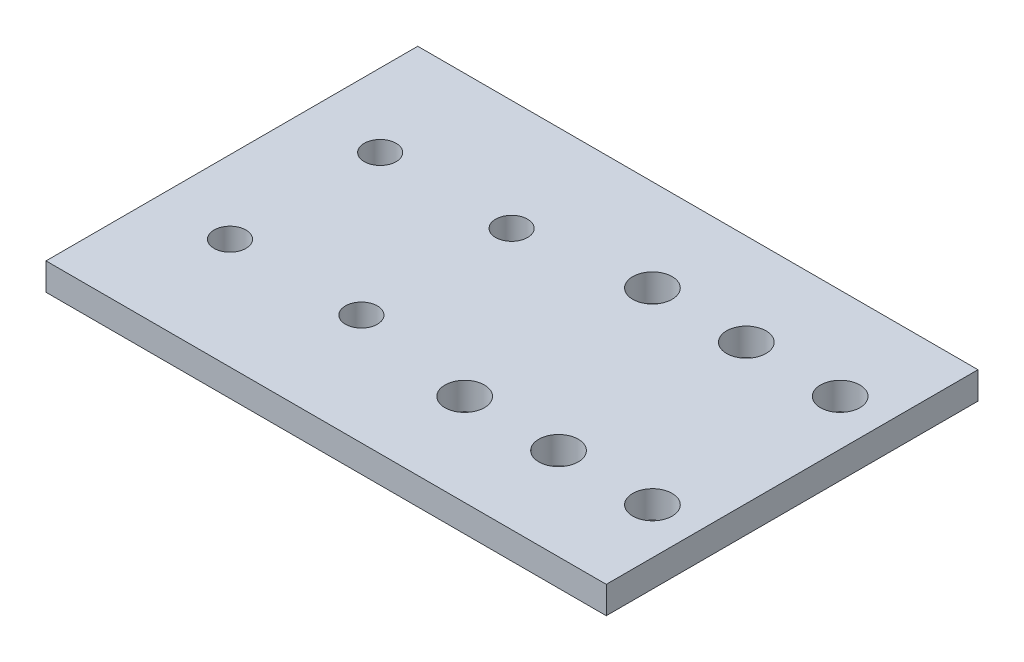
ISO-10303-21;
HEADER;
FILE_DESCRIPTION(('STEP AP214'),'2;1');
FILE_NAME('part.step','',(''),(''),'','','');
FILE_SCHEMA(('AUTOMOTIVE_DESIGN { 1 0 10303 214 1 1 1 1 }'));
ENDSEC;
DATA;
#1=APPLICATION_CONTEXT('core data for automotive mechanical design processes');
#2=APPLICATION_PROTOCOL_DEFINITION('international standard','automotive_design',2000,#1);
#3=PRODUCT_CONTEXT('',#1,'mechanical');
#4=PRODUCT('Part','Part','',(#3));
#5=PRODUCT_RELATED_PRODUCT_CATEGORY('part','',(#4));
#6=PRODUCT_DEFINITION_FORMATION('','',#4);
#7=PRODUCT_DEFINITION_CONTEXT('part definition',#1,'design');
#8=PRODUCT_DEFINITION('design','',#6,#7);
#9=PRODUCT_DEFINITION_SHAPE('','',#8);
#10=(LENGTH_UNIT() NAMED_UNIT(*) SI_UNIT(.MILLI.,.METRE.));
#11=(NAMED_UNIT(*) PLANE_ANGLE_UNIT() SI_UNIT($,.RADIAN.));
#12=(NAMED_UNIT(*) SI_UNIT($,.STERADIAN.) SOLID_ANGLE_UNIT());
#13=UNCERTAINTY_MEASURE_WITH_UNIT(LENGTH_MEASURE(1.E-05),#10,'distance_accuracy_value','');
#14=(GEOMETRIC_REPRESENTATION_CONTEXT(3) GLOBAL_UNCERTAINTY_ASSIGNED_CONTEXT((#13)) GLOBAL_UNIT_ASSIGNED_CONTEXT((#10,
#11,#12)) REPRESENTATION_CONTEXT('',''));
#15=CARTESIAN_POINT('',(0.,0.,0.));
#16=DIRECTION('',(0.,0.,1.));
#17=DIRECTION('',(1.,0.,0.));
#18=AXIS2_PLACEMENT_3D('',#15,#16,#17);
#19=CARTESIAN_POINT('',(0.,2.9,0.));
#20=DIRECTION('',(0.,1.,0.));
#21=DIRECTION('',(0.,0.,1.));
#22=AXIS2_PLACEMENT_3D('',#19,#20,#21);
#23=PLANE('',#22);
#24=DIRECTION('',(0.,0.,1.));
#25=VECTOR('',#24,1.);
#26=CARTESIAN_POINT('',(-10.1174307944163,2.9,0.));
#27=LINE('',#26,#25);
#28=CARTESIAN_POINT('',(-10.1174307944163,2.9,-119.8));
#29=VERTEX_POINT('',#28);
#30=CARTESIAN_POINT('',(-10.1174307944163,2.9,-80.2));
#31=VERTEX_POINT('',#30);
#32=EDGE_CURVE('E61',#29,#31,#27,.T.);
#33=ORIENTED_EDGE('',*,*,#32,.F.);
#34=DIRECTION('',(-1.,0.,0.));
#35=VECTOR('',#34,1.);
#36=CARTESIAN_POINT('',(-69.8,2.9,-119.8));
#37=LINE('',#36,#35);
#38=CARTESIAN_POINT('',(-69.8,2.9,-119.8));
#39=VERTEX_POINT('',#38);
#40=EDGE_CURVE('E97',#29,#39,#37,.T.);
#41=ORIENTED_EDGE('',*,*,#40,.T.);
#42=DIRECTION('',(0.,0.,1.));
#43=VECTOR('',#42,1.);
#44=CARTESIAN_POINT('',(-69.8,2.9,-119.8));
#45=LINE('',#44,#43);
#46=CARTESIAN_POINT('',(-69.8,2.9,-80.2));
#47=VERTEX_POINT('',#46);
#48=EDGE_CURVE('E106',#39,#47,#45,.T.);
#49=ORIENTED_EDGE('',*,*,#48,.T.);
#50=DIRECTION('',(1.,0.,0.));
#51=VECTOR('',#50,1.);
#52=CARTESIAN_POINT('',(-69.8,2.9,-80.2));
#53=LINE('',#52,#51);
#54=EDGE_CURVE('E68',#47,#31,#53,.T.);
#55=ORIENTED_EDGE('',*,*,#54,.T.);
#56=EDGE_LOOP('',(#33,#41,#49,#55));
#57=FACE_BOUND('',#56,.T.);
#58=CARTESIAN_POINT('',(-15.0000000000003,2.9,-110.));
#59=DIRECTION('',(0.,1.,0.));
#60=DIRECTION('',(0.,0.,1.));
#61=AXIS2_PLACEMENT_3D('',#58,#59,#60);
#62=CIRCLE('',#61,2.1);
#63=CARTESIAN_POINT('',(-15.0000000000003,2.9,-107.9));
#64=VERTEX_POINT('',#63);
#65=EDGE_CURVE('E130',#64,#64,#62,.T.);
#66=ORIENTED_EDGE('',*,*,#65,.F.);
#67=EDGE_LOOP('',(#66));
#68=FACE_BOUND('',#67,.T.);
#69=CARTESIAN_POINT('',(-15.0000000000003,2.9,-90.));
#70=DIRECTION('',(0.,1.,0.));
#71=DIRECTION('',(0.,0.,1.));
#72=AXIS2_PLACEMENT_3D('',#69,#70,#71);
#73=CIRCLE('',#72,2.1);
#74=CARTESIAN_POINT('',(-15.0000000000003,2.9,-87.9));
#75=VERTEX_POINT('',#74);
#76=EDGE_CURVE('E122',#75,#75,#73,.F.);
#77=ORIENTED_EDGE('',*,*,#76,.T.);
#78=EDGE_LOOP('',(#77));
#79=FACE_BOUND('',#78,.T.);
#80=CARTESIAN_POINT('',(-25.,2.9,-90.));
#81=DIRECTION('',(0.,1.,0.));
#82=DIRECTION('',(0.,0.,1.));
#83=AXIS2_PLACEMENT_3D('',#80,#81,#82);
#84=CIRCLE('',#83,2.1);
#85=CARTESIAN_POINT('',(-25.,2.9,-87.9));
#86=VERTEX_POINT('',#85);
#87=EDGE_CURVE('E154',#86,#86,#84,.F.);
#88=ORIENTED_EDGE('',*,*,#87,.T.);
#89=EDGE_LOOP('',(#88));
#90=FACE_BOUND('',#89,.T.);
#91=CARTESIAN_POINT('',(-62.,2.9,-108.));
#92=DIRECTION('',(0.,1.,0.));
#93=DIRECTION('',(0.,0.,1.));
#94=AXIS2_PLACEMENT_3D('',#91,#92,#93);
#95=CIRCLE('',#94,1.7);
#96=CARTESIAN_POINT('',(-62.,2.9,-106.3));
#97=VERTEX_POINT('',#96);
#98=EDGE_CURVE('E55',#97,#97,#95,.F.);
#99=ORIENTED_EDGE('',*,*,#98,.T.);
#100=EDGE_LOOP('',(#99));
#101=FACE_BOUND('',#100,.T.);
#102=CARTESIAN_POINT('',(-48.,2.9,-92.));
#103=DIRECTION('',(0.,1.,0.));
#104=DIRECTION('',(0.,0.,1.));
#105=AXIS2_PLACEMENT_3D('',#102,#103,#104);
#106=CIRCLE('',#105,1.7);
#107=CARTESIAN_POINT('',(-48.,2.9,-90.3));
#108=VERTEX_POINT('',#107);
#109=EDGE_CURVE('E182',#108,#108,#106,.T.);
#110=ORIENTED_EDGE('',*,*,#109,.F.);
#111=EDGE_LOOP('',(#110));
#112=FACE_BOUND('',#111,.T.);
#113=CARTESIAN_POINT('',(-48.,2.9,-108.));
#114=DIRECTION('',(0.,1.,0.));
#115=DIRECTION('',(0.,0.,1.));
#116=AXIS2_PLACEMENT_3D('',#113,#114,#115);
#117=CIRCLE('',#116,1.7);
#118=CARTESIAN_POINT('',(-48.,2.9,-106.3));
#119=VERTEX_POINT('',#118);
#120=EDGE_CURVE('E177',#119,#119,#117,.F.);
#121=ORIENTED_EDGE('',*,*,#120,.T.);
#122=EDGE_LOOP('',(#121));
#123=FACE_BOUND('',#122,.T.);
#124=CARTESIAN_POINT('',(-62.,2.9,-92.));
#125=DIRECTION('',(0.,1.,0.));
#126=DIRECTION('',(0.,0.,1.));
#127=AXIS2_PLACEMENT_3D('',#124,#125,#126);
#128=CIRCLE('',#127,1.7);
#129=CARTESIAN_POINT('',(-62.,2.9,-90.3));
#130=VERTEX_POINT('',#129);
#131=EDGE_CURVE('E173',#130,#130,#128,.T.);
#132=ORIENTED_EDGE('',*,*,#131,.F.);
#133=EDGE_LOOP('',(#132));
#134=FACE_BOUND('',#133,.T.);
#135=CARTESIAN_POINT('',(-35.,2.9,-110.));
#136=DIRECTION('',(0.,1.,0.));
#137=DIRECTION('',(0.,0.,1.));
#138=AXIS2_PLACEMENT_3D('',#135,#136,#137);
#139=CIRCLE('',#138,2.1);
#140=CARTESIAN_POINT('',(-35.,2.9,-107.9));
#141=VERTEX_POINT('',#140);
#142=EDGE_CURVE('E145',#141,#141,#139,.T.);
#143=ORIENTED_EDGE('',*,*,#142,.F.);
#144=EDGE_LOOP('',(#143));
#145=FACE_BOUND('',#144,.T.);
#146=CARTESIAN_POINT('',(-35.,2.9,-89.9999999999999));
#147=DIRECTION('',(0.,1.,0.));
#148=DIRECTION('',(0.,0.,1.));
#149=AXIS2_PLACEMENT_3D('',#146,#147,#148);
#150=CIRCLE('',#149,2.1);
#151=CARTESIAN_POINT('',(-35.,2.9,-87.8999999999999));
#152=VERTEX_POINT('',#151);
#153=EDGE_CURVE('E146',#152,#152,#150,.F.);
#154=ORIENTED_EDGE('',*,*,#153,.T.);
#155=EDGE_LOOP('',(#154));
#156=FACE_BOUND('',#155,.T.);
#157=CARTESIAN_POINT('',(-25.0000000000003,2.9,-110.));
#158=DIRECTION('',(0.,1.,0.));
#159=DIRECTION('',(0.,0.,1.));
#160=AXIS2_PLACEMENT_3D('',#157,#158,#159);
#161=CIRCLE('',#160,2.10000000000022);
#162=CARTESIAN_POINT('',(-25.0000000000003,2.9,-107.9));
#163=VERTEX_POINT('',#162);
#164=EDGE_CURVE('E134',#163,#163,#161,.T.);
#165=ORIENTED_EDGE('',*,*,#164,.F.);
#166=EDGE_LOOP('',(#165));
#167=FACE_BOUND('',#166,.T.);
#168=ADVANCED_FACE('F46',(#57,#68,#79,#90,#101,#112,#123,#134,#145,#156,#167),#23,.T.);
#169=CARTESIAN_POINT('',(0.,0.,0.));
#170=DIRECTION('',(0.,1.,0.));
#171=DIRECTION('',(0.,0.,1.));
#172=AXIS2_PLACEMENT_3D('',#169,#170,#171);
#173=PLANE('',#172);
#174=CARTESIAN_POINT('',(-15.0000000000003,0.,-110.));
#175=DIRECTION('',(0.,1.,0.));
#176=DIRECTION('',(0.,0.,1.));
#177=AXIS2_PLACEMENT_3D('',#174,#175,#176);
#178=CIRCLE('',#177,2.1);
#179=CARTESIAN_POINT('',(-15.0000000000003,0.,-107.9));
#180=VERTEX_POINT('',#179);
#181=EDGE_CURVE('E129',#180,#180,#178,.T.);
#182=ORIENTED_EDGE('',*,*,#181,.T.);
#183=EDGE_LOOP('',(#182));
#184=FACE_BOUND('',#183,.T.);
#185=CARTESIAN_POINT('',(-15.0000000000003,0.,-90.));
#186=DIRECTION('',(0.,1.,0.));
#187=DIRECTION('',(0.,0.,1.));
#188=AXIS2_PLACEMENT_3D('',#185,#186,#187);
#189=CIRCLE('',#188,2.1);
#190=CARTESIAN_POINT('',(-15.0000000000003,0.,-87.9));
#191=VERTEX_POINT('',#190);
#192=EDGE_CURVE('E125',#191,#191,#189,.F.);
#193=ORIENTED_EDGE('',*,*,#192,.F.);
#194=EDGE_LOOP('',(#193));
#195=FACE_BOUND('',#194,.T.);
#196=CARTESIAN_POINT('',(-25.,0.,-90.));
#197=DIRECTION('',(0.,1.,0.));
#198=DIRECTION('',(0.,0.,1.));
#199=AXIS2_PLACEMENT_3D('',#196,#197,#198);
#200=CIRCLE('',#199,2.1);
#201=CARTESIAN_POINT('',(-25.,0.,-87.9));
#202=VERTEX_POINT('',#201);
#203=EDGE_CURVE('E150',#202,#202,#200,.F.);
#204=ORIENTED_EDGE('',*,*,#203,.F.);
#205=EDGE_LOOP('',(#204));
#206=FACE_BOUND('',#205,.T.);
#207=CARTESIAN_POINT('',(-35.,0.,-89.9999999999999));
#208=DIRECTION('',(0.,1.,0.));
#209=DIRECTION('',(0.,0.,1.));
#210=AXIS2_PLACEMENT_3D('',#207,#208,#209);
#211=CIRCLE('',#210,2.1);
#212=CARTESIAN_POINT('',(-35.,0.,-87.8999999999999));
#213=VERTEX_POINT('',#212);
#214=EDGE_CURVE('E141',#213,#213,#211,.F.);
#215=ORIENTED_EDGE('',*,*,#214,.F.);
#216=EDGE_LOOP('',(#215));
#217=FACE_BOUND('',#216,.T.);
#218=CARTESIAN_POINT('',(-62.,0.,-108.));
#219=DIRECTION('',(0.,1.,0.));
#220=DIRECTION('',(0.,0.,1.));
#221=AXIS2_PLACEMENT_3D('',#218,#219,#220);
#222=CIRCLE('',#221,1.7);
#223=CARTESIAN_POINT('',(-62.,0.,-106.3));
#224=VERTEX_POINT('',#223);
#225=EDGE_CURVE('E178',#224,#224,#222,.F.);
#226=ORIENTED_EDGE('',*,*,#225,.F.);
#227=EDGE_LOOP('',(#226));
#228=FACE_BOUND('',#227,.T.);
#229=CARTESIAN_POINT('',(-48.,0.,-92.));
#230=DIRECTION('',(0.,1.,0.));
#231=DIRECTION('',(0.,0.,1.));
#232=AXIS2_PLACEMENT_3D('',#229,#230,#231);
#233=CIRCLE('',#232,1.7);
#234=CARTESIAN_POINT('',(-48.,0.,-90.3));
#235=VERTEX_POINT('',#234);
#236=EDGE_CURVE('E196',#235,#235,#233,.T.);
#237=ORIENTED_EDGE('',*,*,#236,.T.);
#238=EDGE_LOOP('',(#237));
#239=FACE_BOUND('',#238,.T.);
#240=CARTESIAN_POINT('',(-48.,0.,-108.));
#241=DIRECTION('',(0.,1.,0.));
#242=DIRECTION('',(0.,0.,1.));
#243=AXIS2_PLACEMENT_3D('',#240,#241,#242);
#244=CIRCLE('',#243,1.7);
#245=CARTESIAN_POINT('',(-48.,0.,-106.3));
#246=VERTEX_POINT('',#245);
#247=EDGE_CURVE('E192',#246,#246,#244,.F.);
#248=ORIENTED_EDGE('',*,*,#247,.F.);
#249=EDGE_LOOP('',(#248));
#250=FACE_BOUND('',#249,.T.);
#251=CARTESIAN_POINT('',(-62.,0.,-92.));
#252=DIRECTION('',(0.,1.,0.));
#253=DIRECTION('',(0.,0.,1.));
#254=AXIS2_PLACEMENT_3D('',#251,#252,#253);
#255=CIRCLE('',#254,1.7);
#256=CARTESIAN_POINT('',(-62.,0.,-90.3));
#257=VERTEX_POINT('',#256);
#258=EDGE_CURVE('E169',#257,#257,#255,.T.);
#259=ORIENTED_EDGE('',*,*,#258,.T.);
#260=EDGE_LOOP('',(#259));
#261=FACE_BOUND('',#260,.T.);
#262=CARTESIAN_POINT('',(-35.,0.,-110.));
#263=DIRECTION('',(0.,1.,0.));
#264=DIRECTION('',(0.,0.,1.));
#265=AXIS2_PLACEMENT_3D('',#262,#263,#264);
#266=CIRCLE('',#265,2.1);
#267=CARTESIAN_POINT('',(-35.,0.,-107.9));
#268=VERTEX_POINT('',#267);
#269=EDGE_CURVE('E165',#268,#268,#266,.T.);
#270=ORIENTED_EDGE('',*,*,#269,.T.);
#271=EDGE_LOOP('',(#270));
#272=FACE_BOUND('',#271,.T.);
#273=CARTESIAN_POINT('',(-25.0000000000003,0.,-110.));
#274=DIRECTION('',(0.,1.,0.));
#275=DIRECTION('',(0.,0.,1.));
#276=AXIS2_PLACEMENT_3D('',#273,#274,#275);
#277=CIRCLE('',#276,2.10000000000022);
#278=CARTESIAN_POINT('',(-25.0000000000003,0.,-107.9));
#279=VERTEX_POINT('',#278);
#280=EDGE_CURVE('E158',#279,#279,#277,.T.);
#281=ORIENTED_EDGE('',*,*,#280,.T.);
#282=EDGE_LOOP('',(#281));
#283=FACE_BOUND('',#282,.T.);
#284=DIRECTION('',(-1.,0.,0.));
#285=VECTOR('',#284,1.);
#286=CARTESIAN_POINT('',(-69.8,0.,-119.8));
#287=LINE('',#286,#285);
#288=CARTESIAN_POINT('',(-10.1174307944163,0.,-119.8));
#289=VERTEX_POINT('',#288);
#290=CARTESIAN_POINT('',(-69.8,0.,-119.8));
#291=VERTEX_POINT('',#290);
#292=EDGE_CURVE('E118',#289,#291,#287,.T.);
#293=ORIENTED_EDGE('',*,*,#292,.F.);
#294=DIRECTION('',(0.,0.,1.));
#295=VECTOR('',#294,1.);
#296=CARTESIAN_POINT('',(-10.1174307944163,0.,0.));
#297=LINE('',#296,#295);
#298=CARTESIAN_POINT('',(-10.1174307944163,0.,-80.2));
#299=VERTEX_POINT('',#298);
#300=EDGE_CURVE('E88',#289,#299,#297,.T.);
#301=ORIENTED_EDGE('',*,*,#300,.T.);
#302=DIRECTION('',(1.,0.,0.));
#303=VECTOR('',#302,1.);
#304=CARTESIAN_POINT('',(-69.8,0.,-80.2));
#305=LINE('',#304,#303);
#306=CARTESIAN_POINT('',(-69.8,0.,-80.2));
#307=VERTEX_POINT('',#306);
#308=EDGE_CURVE('E113',#307,#299,#305,.T.);
#309=ORIENTED_EDGE('',*,*,#308,.F.);
#310=DIRECTION('',(0.,0.,1.));
#311=VECTOR('',#310,1.);
#312=CARTESIAN_POINT('',(-69.8,0.,-119.8));
#313=LINE('',#312,#311);
#314=EDGE_CURVE('E225',#291,#307,#313,.T.);
#315=ORIENTED_EDGE('',*,*,#314,.F.);
#316=EDGE_LOOP('',(#293,#301,#309,#315));
#317=FACE_BOUND('',#316,.T.);
#318=ADVANCED_FACE('F205',(#184,#195,#206,#217,#228,#239,#250,#261,#272,#283,#317),#173,.F.);
#319=CARTESIAN_POINT('',(-48.,2.9,-92.));
#320=DIRECTION('',(0.,-1.,0.));
#321=DIRECTION('',(0.,0.,-1.));
#322=AXIS2_PLACEMENT_3D('',#319,#320,#321);
#323=CYLINDRICAL_SURFACE('',#322,1.7);
#324=ORIENTED_EDGE('',*,*,#109,.T.);
#325=EDGE_LOOP('',(#324));
#326=FACE_BOUND('',#325,.T.);
#327=ORIENTED_EDGE('',*,*,#236,.F.);
#328=EDGE_LOOP('',(#327));
#329=FACE_BOUND('',#328,.T.);
#330=ADVANCED_FACE('F208',(#326,#329),#323,.F.);
#331=CARTESIAN_POINT('',(-48.,2.9,-108.));
#332=DIRECTION('',(0.,-1.,0.));
#333=DIRECTION('',(0.,0.,-1.));
#334=AXIS2_PLACEMENT_3D('',#331,#332,#333);
#335=CYLINDRICAL_SURFACE('',#334,1.7);
#336=ORIENTED_EDGE('',*,*,#120,.F.);
#337=EDGE_LOOP('',(#336));
#338=FACE_BOUND('',#337,.T.);
#339=ORIENTED_EDGE('',*,*,#247,.T.);
#340=EDGE_LOOP('',(#339));
#341=FACE_BOUND('',#340,.T.);
#342=ADVANCED_FACE('F255',(#338,#341),#335,.F.);
#343=CARTESIAN_POINT('',(-62.,2.9,-92.));
#344=DIRECTION('',(0.,-1.,0.));
#345=DIRECTION('',(0.,0.,-1.));
#346=AXIS2_PLACEMENT_3D('',#343,#344,#345);
#347=CYLINDRICAL_SURFACE('',#346,1.7);
#348=ORIENTED_EDGE('',*,*,#131,.T.);
#349=EDGE_LOOP('',(#348));
#350=FACE_BOUND('',#349,.T.);
#351=ORIENTED_EDGE('',*,*,#258,.F.);
#352=EDGE_LOOP('',(#351));
#353=FACE_BOUND('',#352,.T.);
#354=ADVANCED_FACE('F48',(#350,#353),#347,.F.);
#355=CARTESIAN_POINT('',(-62.,2.9,-108.));
#356=DIRECTION('',(0.,-1.,0.));
#357=DIRECTION('',(0.,0.,-1.));
#358=AXIS2_PLACEMENT_3D('',#355,#356,#357);
#359=CYLINDRICAL_SURFACE('',#358,1.7);
#360=ORIENTED_EDGE('',*,*,#98,.F.);
#361=EDGE_LOOP('',(#360));
#362=FACE_BOUND('',#361,.T.);
#363=ORIENTED_EDGE('',*,*,#225,.T.);
#364=EDGE_LOOP('',(#363));
#365=FACE_BOUND('',#364,.T.);
#366=ADVANCED_FACE('F203',(#362,#365),#359,.F.);
#367=CARTESIAN_POINT('',(-35.,0.,-110.));
#368=DIRECTION('',(0.,1.,0.));
#369=DIRECTION('',(0.,0.,1.));
#370=AXIS2_PLACEMENT_3D('',#367,#368,#369);
#371=CYLINDRICAL_SURFACE('',#370,2.1);
#372=ORIENTED_EDGE('',*,*,#269,.F.);
#373=EDGE_LOOP('',(#372));
#374=FACE_BOUND('',#373,.T.);
#375=ORIENTED_EDGE('',*,*,#142,.T.);
#376=EDGE_LOOP('',(#375));
#377=FACE_BOUND('',#376,.T.);
#378=ADVANCED_FACE('F248',(#374,#377),#371,.F.);
#379=CARTESIAN_POINT('',(-35.,0.,-89.9999999999999));
#380=DIRECTION('',(0.,1.,0.));
#381=DIRECTION('',(0.,0.,1.));
#382=AXIS2_PLACEMENT_3D('',#379,#380,#381);
#383=CYLINDRICAL_SURFACE('',#382,2.1);
#384=ORIENTED_EDGE('',*,*,#214,.T.);
#385=EDGE_LOOP('',(#384));
#386=FACE_BOUND('',#385,.T.);
#387=ORIENTED_EDGE('',*,*,#153,.F.);
#388=EDGE_LOOP('',(#387));
#389=FACE_BOUND('',#388,.T.);
#390=ADVANCED_FACE('F287',(#386,#389),#383,.F.);
#391=CARTESIAN_POINT('',(-25.,0.,-90.));
#392=DIRECTION('',(0.,1.,0.));
#393=DIRECTION('',(0.,0.,1.));
#394=AXIS2_PLACEMENT_3D('',#391,#392,#393);
#395=CYLINDRICAL_SURFACE('',#394,2.1);
#396=ORIENTED_EDGE('',*,*,#203,.T.);
#397=EDGE_LOOP('',(#396));
#398=FACE_BOUND('',#397,.T.);
#399=ORIENTED_EDGE('',*,*,#87,.F.);
#400=EDGE_LOOP('',(#399));
#401=FACE_BOUND('',#400,.T.);
#402=ADVANCED_FACE('F278',(#398,#401),#395,.F.);
#403=CARTESIAN_POINT('',(-25.0000000000003,0.,-110.));
#404=DIRECTION('',(0.,1.,0.));
#405=DIRECTION('',(0.,0.,1.));
#406=AXIS2_PLACEMENT_3D('',#403,#404,#405);
#407=CYLINDRICAL_SURFACE('',#406,2.10000000000022);
#408=ORIENTED_EDGE('',*,*,#280,.F.);
#409=EDGE_LOOP('',(#408));
#410=FACE_BOUND('',#409,.T.);
#411=ORIENTED_EDGE('',*,*,#164,.T.);
#412=EDGE_LOOP('',(#411));
#413=FACE_BOUND('',#412,.T.);
#414=ADVANCED_FACE('F275',(#410,#413),#407,.F.);
#415=CARTESIAN_POINT('',(-15.0000000000003,0.,-110.));
#416=DIRECTION('',(0.,1.,0.));
#417=DIRECTION('',(0.,0.,1.));
#418=AXIS2_PLACEMENT_3D('',#415,#416,#417);
#419=CYLINDRICAL_SURFACE('',#418,2.1);
#420=ORIENTED_EDGE('',*,*,#181,.F.);
#421=EDGE_LOOP('',(#420));
#422=FACE_BOUND('',#421,.T.);
#423=ORIENTED_EDGE('',*,*,#65,.T.);
#424=EDGE_LOOP('',(#423));
#425=FACE_BOUND('',#424,.T.);
#426=ADVANCED_FACE('F277',(#422,#425),#419,.F.);
#427=CARTESIAN_POINT('',(-15.0000000000003,0.,-90.));
#428=DIRECTION('',(0.,1.,0.));
#429=DIRECTION('',(0.,0.,1.));
#430=AXIS2_PLACEMENT_3D('',#427,#428,#429);
#431=CYLINDRICAL_SURFACE('',#430,2.1);
#432=ORIENTED_EDGE('',*,*,#192,.T.);
#433=EDGE_LOOP('',(#432));
#434=FACE_BOUND('',#433,.T.);
#435=ORIENTED_EDGE('',*,*,#76,.F.);
#436=EDGE_LOOP('',(#435));
#437=FACE_BOUND('',#436,.T.);
#438=ADVANCED_FACE('F284',(#434,#437),#431,.F.);
#439=CARTESIAN_POINT('',(-69.8,0.,-119.8));
#440=DIRECTION('',(0.,0.,-1.));
#441=DIRECTION('',(-1.,0.,0.));
#442=AXIS2_PLACEMENT_3D('',#439,#440,#441);
#443=PLANE('',#442);
#444=DIRECTION('',(0.,1.,0.));
#445=VECTOR('',#444,1.);
#446=CARTESIAN_POINT('',(-10.1174307944163,-7.1,-119.8));
#447=LINE('',#446,#445);
#448=EDGE_CURVE('E85',#289,#29,#447,.T.);
#449=ORIENTED_EDGE('',*,*,#448,.F.);
#450=ORIENTED_EDGE('',*,*,#292,.T.);
#451=DIRECTION('',(0.,1.,0.));
#452=VECTOR('',#451,1.);
#453=CARTESIAN_POINT('',(-69.8,0.,-119.8));
#454=LINE('',#453,#452);
#455=EDGE_CURVE('E103',#291,#39,#454,.T.);
#456=ORIENTED_EDGE('',*,*,#455,.T.);
#457=ORIENTED_EDGE('',*,*,#40,.F.);
#458=EDGE_LOOP('',(#449,#450,#456,#457));
#459=FACE_BOUND('',#458,.T.);
#460=ADVANCED_FACE('F101',(#459),#443,.T.);
#461=CARTESIAN_POINT('',(-69.8,0.,-80.2));
#462=DIRECTION('',(0.,0.,1.));
#463=DIRECTION('',(1.,0.,0.));
#464=AXIS2_PLACEMENT_3D('',#461,#462,#463);
#465=PLANE('',#464);
#466=DIRECTION('',(0.,-1.,0.));
#467=VECTOR('',#466,1.);
#468=CARTESIAN_POINT('',(-10.1174307944163,0.,-80.2));
#469=LINE('',#468,#467);
#470=EDGE_CURVE('E11',#31,#299,#469,.T.);
#471=ORIENTED_EDGE('',*,*,#470,.F.);
#472=ORIENTED_EDGE('',*,*,#54,.F.);
#473=DIRECTION('',(0.,1.,0.));
#474=VECTOR('',#473,1.);
#475=CARTESIAN_POINT('',(-69.8,0.,-80.2));
#476=LINE('',#475,#474);
#477=EDGE_CURVE('E119',#307,#47,#476,.T.);
#478=ORIENTED_EDGE('',*,*,#477,.F.);
#479=ORIENTED_EDGE('',*,*,#308,.T.);
#480=EDGE_LOOP('',(#471,#472,#478,#479));
#481=FACE_BOUND('',#480,.T.);
#482=ADVANCED_FACE('F231',(#481),#465,.T.);
#483=CARTESIAN_POINT('',(-69.8,0.,-119.8));
#484=DIRECTION('',(-1.,0.,0.));
#485=DIRECTION('',(0.,0.,1.));
#486=AXIS2_PLACEMENT_3D('',#483,#484,#485);
#487=PLANE('',#486);
#488=ORIENTED_EDGE('',*,*,#48,.F.);
#489=ORIENTED_EDGE('',*,*,#455,.F.);
#490=ORIENTED_EDGE('',*,*,#314,.T.);
#491=ORIENTED_EDGE('',*,*,#477,.T.);
#492=EDGE_LOOP('',(#488,#489,#490,#491));
#493=FACE_BOUND('',#492,.T.);
#494=ADVANCED_FACE('F232',(#493),#487,.T.);
#495=CARTESIAN_POINT('',(-10.1174307944163,-7.1,0.));
#496=DIRECTION('',(-1.,0.,0.));
#497=DIRECTION('',(0.,0.,1.));
#498=AXIS2_PLACEMENT_3D('',#495,#496,#497);
#499=PLANE('',#498);
#500=ORIENTED_EDGE('',*,*,#448,.T.);
#501=ORIENTED_EDGE('',*,*,#32,.T.);
#502=ORIENTED_EDGE('',*,*,#470,.T.);
#503=ORIENTED_EDGE('',*,*,#300,.F.);
#504=EDGE_LOOP('',(#500,#501,#502,#503));
#505=FACE_BOUND('',#504,.T.);
#506=ADVANCED_FACE('F86',(#505),#499,.F.);
#507=CLOSED_SHELL('',(#168,#318,#330,#342,#354,#366,#378,#390,#402,#414,#426,#438,#460,#482,
#494,#506));
#508=MANIFOLD_SOLID_BREP('B2',#507);
#509=ADVANCED_BREP_SHAPE_REPRESENTATION('',(#18,#508),#14);
#510=SHAPE_DEFINITION_REPRESENTATION(#9,#509);
ENDSEC;
END-ISO-10303-21;
